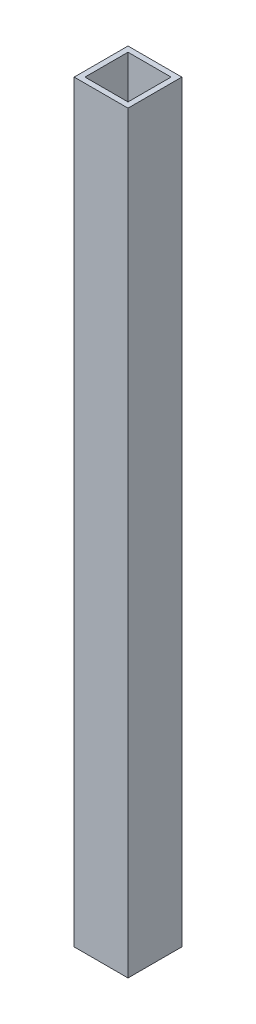
ISO-10303-21;
HEADER;
FILE_DESCRIPTION(('STEP AP214'),'2;1');
FILE_NAME('part.step','',(''),(''),'','','');
FILE_SCHEMA(('AUTOMOTIVE_DESIGN { 1 0 10303 214 1 1 1 1 }'));
ENDSEC;
DATA;
#1=APPLICATION_CONTEXT('core data for automotive mechanical design processes');
#2=APPLICATION_PROTOCOL_DEFINITION('international standard','automotive_design',2000,#1);
#3=PRODUCT_CONTEXT('',#1,'mechanical');
#4=PRODUCT('Part','Part','',(#3));
#5=PRODUCT_RELATED_PRODUCT_CATEGORY('part','',(#4));
#6=PRODUCT_DEFINITION_FORMATION('','',#4);
#7=PRODUCT_DEFINITION_CONTEXT('part definition',#1,'design');
#8=PRODUCT_DEFINITION('design','',#6,#7);
#9=PRODUCT_DEFINITION_SHAPE('','',#8);
#10=(LENGTH_UNIT() NAMED_UNIT(*) SI_UNIT(.MILLI.,.METRE.));
#11=(NAMED_UNIT(*) PLANE_ANGLE_UNIT() SI_UNIT($,.RADIAN.));
#12=(NAMED_UNIT(*) SI_UNIT($,.STERADIAN.) SOLID_ANGLE_UNIT());
#13=UNCERTAINTY_MEASURE_WITH_UNIT(LENGTH_MEASURE(1.E-05),#10,'distance_accuracy_value','');
#14=(GEOMETRIC_REPRESENTATION_CONTEXT(3) GLOBAL_UNCERTAINTY_ASSIGNED_CONTEXT((#13)) GLOBAL_UNIT_ASSIGNED_CONTEXT((#10,
#11,#12)) REPRESENTATION_CONTEXT('',''));
#15=CARTESIAN_POINT('',(0.,0.,0.));
#16=DIRECTION('',(0.,0.,1.));
#17=DIRECTION('',(1.,0.,0.));
#18=AXIS2_PLACEMENT_3D('',#15,#16,#17);
#19=CARTESIAN_POINT('',(0.,700.,0.));
#20=DIRECTION('',(0.,-1.,0.));
#21=DIRECTION('',(0.,0.,-1.));
#22=AXIS2_PLACEMENT_3D('',#19,#20,#21);
#23=PLANE('',#22);
#24=DIRECTION('',(0.,0.,1.));
#25=VECTOR('',#24,1.);
#26=CARTESIAN_POINT('',(0.,700.,0.));
#27=LINE('',#26,#25);
#28=CARTESIAN_POINT('',(0.,700.,-50.));
#29=VERTEX_POINT('',#28);
#30=CARTESIAN_POINT('',(0.,700.,0.));
#31=VERTEX_POINT('',#30);
#32=EDGE_CURVE('E135',#29,#31,#27,.T.);
#33=ORIENTED_EDGE('',*,*,#32,.T.);
#34=DIRECTION('',(1.,0.,0.));
#35=VECTOR('',#34,1.);
#36=CARTESIAN_POINT('',(0.,700.,0.));
#37=LINE('',#36,#35);
#38=CARTESIAN_POINT('',(50.,700.,0.));
#39=VERTEX_POINT('',#38);
#40=EDGE_CURVE('E138',#31,#39,#37,.T.);
#41=ORIENTED_EDGE('',*,*,#40,.T.);
#42=DIRECTION('',(0.,0.,-1.));
#43=VECTOR('',#42,1.);
#44=CARTESIAN_POINT('',(50.,700.,0.));
#45=LINE('',#44,#43);
#46=CARTESIAN_POINT('',(50.,700.,-50.));
#47=VERTEX_POINT('',#46);
#48=EDGE_CURVE('E141',#39,#47,#45,.T.);
#49=ORIENTED_EDGE('',*,*,#48,.T.);
#50=DIRECTION('',(-1.,0.,0.));
#51=VECTOR('',#50,1.);
#52=CARTESIAN_POINT('',(0.,700.,-50.));
#53=LINE('',#52,#51);
#54=EDGE_CURVE('E143',#47,#29,#53,.T.);
#55=ORIENTED_EDGE('',*,*,#54,.T.);
#56=EDGE_LOOP('',(#33,#41,#49,#55));
#57=FACE_BOUND('',#56,.T.);
#58=DIRECTION('',(1.,0.,0.));
#59=VECTOR('',#58,1.);
#60=CARTESIAN_POINT('',(5.,700.,-5.));
#61=LINE('',#60,#59);
#62=CARTESIAN_POINT('',(5.,700.,-5.));
#63=VERTEX_POINT('',#62);
#64=CARTESIAN_POINT('',(45.,700.,-5.));
#65=VERTEX_POINT('',#64);
#66=EDGE_CURVE('E99',#63,#65,#61,.T.);
#67=ORIENTED_EDGE('',*,*,#66,.F.);
#68=DIRECTION('',(0.,0.,1.));
#69=VECTOR('',#68,1.);
#70=CARTESIAN_POINT('',(5.,700.,-5.));
#71=LINE('',#70,#69);
#72=CARTESIAN_POINT('',(5.,700.,-45.));
#73=VERTEX_POINT('',#72);
#74=EDGE_CURVE('E121',#73,#63,#71,.T.);
#75=ORIENTED_EDGE('',*,*,#74,.F.);
#76=DIRECTION('',(-1.,0.,0.));
#77=VECTOR('',#76,1.);
#78=CARTESIAN_POINT('',(5.,700.,-45.));
#79=LINE('',#78,#77);
#80=CARTESIAN_POINT('',(45.,700.,-45.));
#81=VERTEX_POINT('',#80);
#82=EDGE_CURVE('E119',#81,#73,#79,.T.);
#83=ORIENTED_EDGE('',*,*,#82,.F.);
#84=DIRECTION('',(0.,0.,-1.));
#85=VECTOR('',#84,1.);
#86=CARTESIAN_POINT('',(45.,700.,-5.));
#87=LINE('',#86,#85);
#88=EDGE_CURVE('E107',#65,#81,#87,.T.);
#89=ORIENTED_EDGE('',*,*,#88,.F.);
#90=EDGE_LOOP('',(#67,#75,#83,#89));
#91=FACE_BOUND('',#90,.T.);
#92=ADVANCED_FACE('F34',(#57,#91),#23,.F.);
#93=CARTESIAN_POINT('',(0.,0.,0.));
#94=DIRECTION('',(0.,-1.,0.));
#95=DIRECTION('',(0.,0.,-1.));
#96=AXIS2_PLACEMENT_3D('',#93,#94,#95);
#97=PLANE('',#96);
#98=DIRECTION('',(0.,0.,1.));
#99=VECTOR('',#98,1.);
#100=CARTESIAN_POINT('',(0.,0.,0.));
#101=LINE('',#100,#99);
#102=CARTESIAN_POINT('',(0.,0.,-50.));
#103=VERTEX_POINT('',#102);
#104=CARTESIAN_POINT('',(0.,0.,0.));
#105=VERTEX_POINT('',#104);
#106=EDGE_CURVE('E115',#103,#105,#101,.T.);
#107=ORIENTED_EDGE('',*,*,#106,.F.);
#108=DIRECTION('',(-1.,0.,0.));
#109=VECTOR('',#108,1.);
#110=CARTESIAN_POINT('',(0.,0.,-50.));
#111=LINE('',#110,#109);
#112=CARTESIAN_POINT('',(50.,0.,-50.));
#113=VERTEX_POINT('',#112);
#114=EDGE_CURVE('E139',#113,#103,#111,.T.);
#115=ORIENTED_EDGE('',*,*,#114,.F.);
#116=DIRECTION('',(0.,0.,-1.));
#117=VECTOR('',#116,1.);
#118=CARTESIAN_POINT('',(50.,0.,0.));
#119=LINE('',#118,#117);
#120=CARTESIAN_POINT('',(50.,0.,0.));
#121=VERTEX_POINT('',#120);
#122=EDGE_CURVE('E150',#121,#113,#119,.T.);
#123=ORIENTED_EDGE('',*,*,#122,.F.);
#124=DIRECTION('',(1.,0.,0.));
#125=VECTOR('',#124,1.);
#126=CARTESIAN_POINT('',(0.,0.,0.));
#127=LINE('',#126,#125);
#128=EDGE_CURVE('E148',#105,#121,#127,.T.);
#129=ORIENTED_EDGE('',*,*,#128,.F.);
#130=EDGE_LOOP('',(#107,#115,#123,#129));
#131=FACE_BOUND('',#130,.T.);
#132=DIRECTION('',(0.,0.,1.));
#133=VECTOR('',#132,1.);
#134=CARTESIAN_POINT('',(5.,0.,-5.));
#135=LINE('',#134,#133);
#136=CARTESIAN_POINT('',(5.,0.,-45.));
#137=VERTEX_POINT('',#136);
#138=CARTESIAN_POINT('',(5.,0.,-5.));
#139=VERTEX_POINT('',#138);
#140=EDGE_CURVE('E108',#137,#139,#135,.T.);
#141=ORIENTED_EDGE('',*,*,#140,.T.);
#142=DIRECTION('',(1.,0.,0.));
#143=VECTOR('',#142,1.);
#144=CARTESIAN_POINT('',(5.,0.,-5.));
#145=LINE('',#144,#143);
#146=CARTESIAN_POINT('',(45.,0.,-5.));
#147=VERTEX_POINT('',#146);
#148=EDGE_CURVE('E57',#139,#147,#145,.T.);
#149=ORIENTED_EDGE('',*,*,#148,.T.);
#150=DIRECTION('',(0.,0.,-1.));
#151=VECTOR('',#150,1.);
#152=CARTESIAN_POINT('',(45.,0.,-5.));
#153=LINE('',#152,#151);
#154=CARTESIAN_POINT('',(45.,0.,-45.));
#155=VERTEX_POINT('',#154);
#156=EDGE_CURVE('E114',#147,#155,#153,.T.);
#157=ORIENTED_EDGE('',*,*,#156,.T.);
#158=DIRECTION('',(-1.,0.,0.));
#159=VECTOR('',#158,1.);
#160=CARTESIAN_POINT('',(5.,0.,-45.));
#161=LINE('',#160,#159);
#162=EDGE_CURVE('E127',#155,#137,#161,.T.);
#163=ORIENTED_EDGE('',*,*,#162,.T.);
#164=EDGE_LOOP('',(#141,#149,#157,#163));
#165=FACE_BOUND('',#164,.T.);
#166=ADVANCED_FACE('F168',(#131,#165),#97,.T.);
#167=CARTESIAN_POINT('',(0.,700.,0.));
#168=DIRECTION('',(1.,0.,0.));
#169=DIRECTION('',(0.,0.,-1.));
#170=AXIS2_PLACEMENT_3D('',#167,#168,#169);
#171=PLANE('',#170);
#172=ORIENTED_EDGE('',*,*,#106,.T.);
#173=DIRECTION('',(0.,-1.,0.));
#174=VECTOR('',#173,1.);
#175=CARTESIAN_POINT('',(0.,700.,0.));
#176=LINE('',#175,#174);
#177=EDGE_CURVE('E11',#31,#105,#176,.T.);
#178=ORIENTED_EDGE('',*,*,#177,.F.);
#179=ORIENTED_EDGE('',*,*,#32,.F.);
#180=DIRECTION('',(0.,-1.,0.));
#181=VECTOR('',#180,1.);
#182=CARTESIAN_POINT('',(0.,700.,-50.));
#183=LINE('',#182,#181);
#184=EDGE_CURVE('E145',#29,#103,#183,.T.);
#185=ORIENTED_EDGE('',*,*,#184,.T.);
#186=EDGE_LOOP('',(#172,#178,#179,#185));
#187=FACE_BOUND('',#186,.T.);
#188=ADVANCED_FACE('F36',(#187),#171,.F.);
#189=CARTESIAN_POINT('',(0.,700.,0.));
#190=DIRECTION('',(0.,0.,-1.));
#191=DIRECTION('',(-1.,0.,0.));
#192=AXIS2_PLACEMENT_3D('',#189,#190,#191);
#193=PLANE('',#192);
#194=ORIENTED_EDGE('',*,*,#128,.T.);
#195=DIRECTION('',(0.,-1.,0.));
#196=VECTOR('',#195,1.);
#197=CARTESIAN_POINT('',(50.,700.,0.));
#198=LINE('',#197,#196);
#199=EDGE_CURVE('E42',#39,#121,#198,.T.);
#200=ORIENTED_EDGE('',*,*,#199,.F.);
#201=ORIENTED_EDGE('',*,*,#40,.F.);
#202=ORIENTED_EDGE('',*,*,#177,.T.);
#203=EDGE_LOOP('',(#194,#200,#201,#202));
#204=FACE_BOUND('',#203,.T.);
#205=ADVANCED_FACE('F178',(#204),#193,.F.);
#206=CARTESIAN_POINT('',(50.,700.,0.));
#207=DIRECTION('',(-1.,0.,0.));
#208=DIRECTION('',(0.,0.,1.));
#209=AXIS2_PLACEMENT_3D('',#206,#207,#208);
#210=PLANE('',#209);
#211=ORIENTED_EDGE('',*,*,#122,.T.);
#212=DIRECTION('',(0.,-1.,0.));
#213=VECTOR('',#212,1.);
#214=CARTESIAN_POINT('',(50.,700.,-50.));
#215=LINE('',#214,#213);
#216=EDGE_CURVE('E155',#47,#113,#215,.T.);
#217=ORIENTED_EDGE('',*,*,#216,.F.);
#218=ORIENTED_EDGE('',*,*,#48,.F.);
#219=ORIENTED_EDGE('',*,*,#199,.T.);
#220=EDGE_LOOP('',(#211,#217,#218,#219));
#221=FACE_BOUND('',#220,.T.);
#222=ADVANCED_FACE('F162',(#221),#210,.F.);
#223=CARTESIAN_POINT('',(0.,700.,-50.));
#224=DIRECTION('',(0.,0.,1.));
#225=DIRECTION('',(1.,0.,0.));
#226=AXIS2_PLACEMENT_3D('',#223,#224,#225);
#227=PLANE('',#226);
#228=ORIENTED_EDGE('',*,*,#114,.T.);
#229=ORIENTED_EDGE('',*,*,#184,.F.);
#230=ORIENTED_EDGE('',*,*,#54,.F.);
#231=ORIENTED_EDGE('',*,*,#216,.T.);
#232=EDGE_LOOP('',(#228,#229,#230,#231));
#233=FACE_BOUND('',#232,.T.);
#234=ADVANCED_FACE('F172',(#233),#227,.F.);
#235=CARTESIAN_POINT('',(5.,700.,-5.));
#236=DIRECTION('',(0.,0.,-1.));
#237=DIRECTION('',(-1.,0.,0.));
#238=AXIS2_PLACEMENT_3D('',#235,#236,#237);
#239=PLANE('',#238);
#240=ORIENTED_EDGE('',*,*,#148,.F.);
#241=DIRECTION('',(0.,-1.,0.));
#242=VECTOR('',#241,1.);
#243=CARTESIAN_POINT('',(5.,700.,-5.));
#244=LINE('',#243,#242);
#245=EDGE_CURVE('E103',#63,#139,#244,.T.);
#246=ORIENTED_EDGE('',*,*,#245,.F.);
#247=ORIENTED_EDGE('',*,*,#66,.T.);
#248=DIRECTION('',(0.,-1.,0.));
#249=VECTOR('',#248,1.);
#250=CARTESIAN_POINT('',(45.,700.,-5.));
#251=LINE('',#250,#249);
#252=EDGE_CURVE('E102',#65,#147,#251,.T.);
#253=ORIENTED_EDGE('',*,*,#252,.T.);
#254=EDGE_LOOP('',(#240,#246,#247,#253));
#255=FACE_BOUND('',#254,.T.);
#256=ADVANCED_FACE('F101',(#255),#239,.T.);
#257=CARTESIAN_POINT('',(45.,700.,-5.));
#258=DIRECTION('',(-1.,0.,0.));
#259=DIRECTION('',(0.,0.,1.));
#260=AXIS2_PLACEMENT_3D('',#257,#258,#259);
#261=PLANE('',#260);
#262=ORIENTED_EDGE('',*,*,#156,.F.);
#263=ORIENTED_EDGE('',*,*,#252,.F.);
#264=ORIENTED_EDGE('',*,*,#88,.T.);
#265=DIRECTION('',(0.,-1.,0.));
#266=VECTOR('',#265,1.);
#267=CARTESIAN_POINT('',(45.,700.,-45.));
#268=LINE('',#267,#266);
#269=EDGE_CURVE('E116',#81,#155,#268,.T.);
#270=ORIENTED_EDGE('',*,*,#269,.T.);
#271=EDGE_LOOP('',(#262,#263,#264,#270));
#272=FACE_BOUND('',#271,.T.);
#273=ADVANCED_FACE('F111',(#272),#261,.T.);
#274=CARTESIAN_POINT('',(5.,700.,-45.));
#275=DIRECTION('',(0.,0.,1.));
#276=DIRECTION('',(1.,0.,0.));
#277=AXIS2_PLACEMENT_3D('',#274,#275,#276);
#278=PLANE('',#277);
#279=ORIENTED_EDGE('',*,*,#162,.F.);
#280=ORIENTED_EDGE('',*,*,#269,.F.);
#281=ORIENTED_EDGE('',*,*,#82,.T.);
#282=DIRECTION('',(0.,-1.,0.));
#283=VECTOR('',#282,1.);
#284=CARTESIAN_POINT('',(5.,700.,-45.));
#285=LINE('',#284,#283);
#286=EDGE_CURVE('E49',#73,#137,#285,.T.);
#287=ORIENTED_EDGE('',*,*,#286,.T.);
#288=EDGE_LOOP('',(#279,#280,#281,#287));
#289=FACE_BOUND('',#288,.T.);
#290=ADVANCED_FACE('F201',(#289),#278,.T.);
#291=CARTESIAN_POINT('',(5.,700.,-5.));
#292=DIRECTION('',(1.,0.,0.));
#293=DIRECTION('',(0.,0.,-1.));
#294=AXIS2_PLACEMENT_3D('',#291,#292,#293);
#295=PLANE('',#294);
#296=ORIENTED_EDGE('',*,*,#140,.F.);
#297=ORIENTED_EDGE('',*,*,#286,.F.);
#298=ORIENTED_EDGE('',*,*,#74,.T.);
#299=ORIENTED_EDGE('',*,*,#245,.T.);
#300=EDGE_LOOP('',(#296,#297,#298,#299));
#301=FACE_BOUND('',#300,.T.);
#302=ADVANCED_FACE('F205',(#301),#295,.T.);
#303=CLOSED_SHELL('',(#92,#166,#188,#205,#222,#234,#256,#273,#290,#302));
#304=MANIFOLD_SOLID_BREP('B2',#303);
#305=ADVANCED_BREP_SHAPE_REPRESENTATION('',(#18,#304),#14);
#306=SHAPE_DEFINITION_REPRESENTATION(#9,#305);
ENDSEC;
END-ISO-10303-21;
